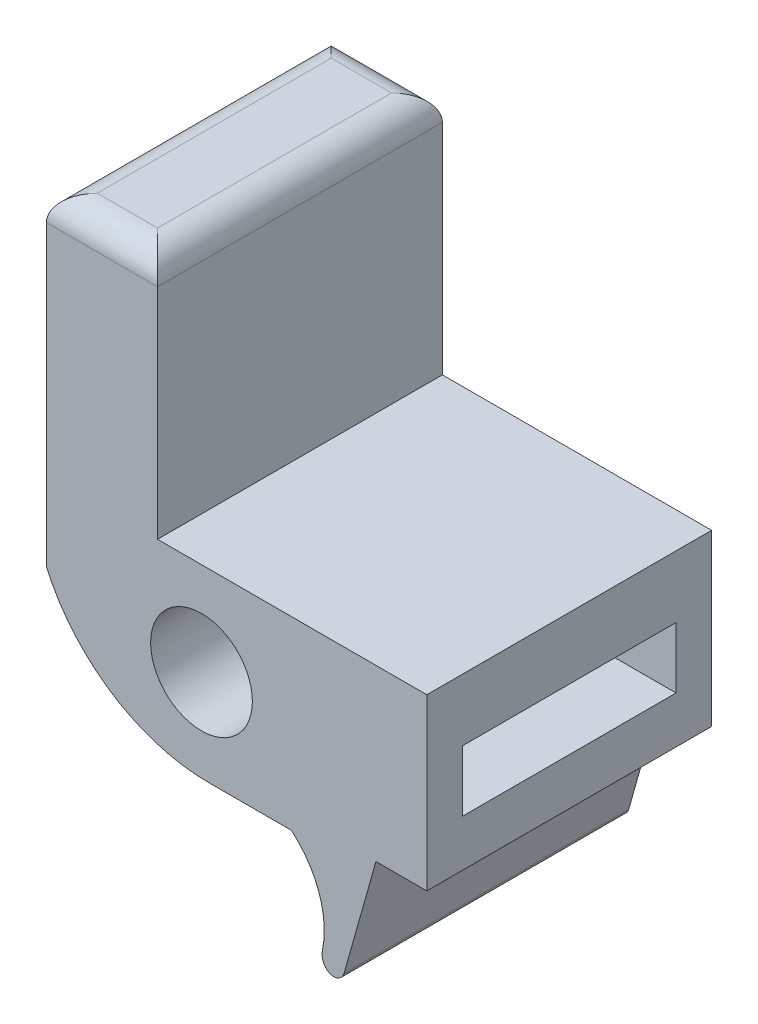
ISO-10303-21;
HEADER;
FILE_DESCRIPTION(('STEP AP214'),'2;1');
FILE_NAME('part.step','',(''),(''),'','','');
FILE_SCHEMA(('AUTOMOTIVE_DESIGN { 1 0 10303 214 1 1 1 1 }'));
ENDSEC;
DATA;
#1=APPLICATION_CONTEXT('core data for automotive mechanical design processes');
#2=APPLICATION_PROTOCOL_DEFINITION('international standard','automotive_design',2000,#1);
#3=PRODUCT_CONTEXT('',#1,'mechanical');
#4=PRODUCT('Part','Part','',(#3));
#5=PRODUCT_RELATED_PRODUCT_CATEGORY('part','',(#4));
#6=PRODUCT_DEFINITION_FORMATION('','',#4);
#7=PRODUCT_DEFINITION_CONTEXT('part definition',#1,'design');
#8=PRODUCT_DEFINITION('design','',#6,#7);
#9=PRODUCT_DEFINITION_SHAPE('','',#8);
#10=(LENGTH_UNIT() NAMED_UNIT(*) SI_UNIT(.MILLI.,.METRE.));
#11=(NAMED_UNIT(*) PLANE_ANGLE_UNIT() SI_UNIT($,.RADIAN.));
#12=(NAMED_UNIT(*) SI_UNIT($,.STERADIAN.) SOLID_ANGLE_UNIT());
#13=UNCERTAINTY_MEASURE_WITH_UNIT(LENGTH_MEASURE(1.E-05),#10,'distance_accuracy_value','');
#14=(GEOMETRIC_REPRESENTATION_CONTEXT(3) GLOBAL_UNCERTAINTY_ASSIGNED_CONTEXT((#13)) GLOBAL_UNIT_ASSIGNED_CONTEXT((#10,
#11,#12)) REPRESENTATION_CONTEXT('',''));
#15=CARTESIAN_POINT('',(0.,0.,0.));
#16=DIRECTION('',(0.,0.,1.));
#17=DIRECTION('',(1.,0.,0.));
#18=AXIS2_PLACEMENT_3D('',#15,#16,#17);
#19=CARTESIAN_POINT('',(-1.30401194965657,6.63,3.2));
#20=DIRECTION('',(-1.,0.,0.));
#21=DIRECTION('',(0.,0.,1.));
#22=AXIS2_PLACEMENT_3D('',#19,#20,#21);
#23=PLANE('',#22);
#24=DIRECTION('',(0.,-1.,0.));
#25=VECTOR('',#24,1.);
#26=CARTESIAN_POINT('',(-1.30401194965657,6.63,3.2));
#27=LINE('',#26,#25);
#28=CARTESIAN_POINT('',(-1.30401194965657,6.13,3.2));
#29=VERTEX_POINT('',#28);
#30=CARTESIAN_POINT('',(-1.30401194965657,1.83,3.2));
#31=VERTEX_POINT('',#30);
#32=EDGE_CURVE('E273',#29,#31,#27,.T.);
#33=ORIENTED_EDGE('',*,*,#32,.T.);
#34=DIRECTION('',(0.,0.,1.));
#35=VECTOR('',#34,1.);
#36=CARTESIAN_POINT('',(-1.30401194965657,1.83,-8.35225188642688));
#37=LINE('',#36,#35);
#38=CARTESIAN_POINT('',(-1.30401194965657,1.83,-2.4));
#39=VERTEX_POINT('',#38);
#40=EDGE_CURVE('E201',#39,#31,#37,.T.);
#41=ORIENTED_EDGE('',*,*,#40,.F.);
#42=DIRECTION('',(0.,-1.,0.));
#43=VECTOR('',#42,1.);
#44=CARTESIAN_POINT('',(-1.30401194965657,6.63,-2.4));
#45=LINE('',#44,#43);
#46=CARTESIAN_POINT('',(-1.30401194965657,6.13,-2.4));
#47=VERTEX_POINT('',#46);
#48=EDGE_CURVE('E172',#47,#39,#45,.T.);
#49=ORIENTED_EDGE('',*,*,#48,.F.);
#50=DIRECTION('',(0.,0.,-1.));
#51=VECTOR('',#50,1.);
#52=CARTESIAN_POINT('',(-1.30401194965657,6.13,3.2));
#53=LINE('',#52,#51);
#54=EDGE_CURVE('E11',#47,#29,#53,.F.);
#55=ORIENTED_EDGE('',*,*,#54,.T.);
#56=EDGE_LOOP('',(#33,#41,#49,#55));
#57=FACE_BOUND('',#56,.T.);
#58=ADVANCED_FACE('F39',(#57),#23,.F.);
#59=CARTESIAN_POINT('',(0.,0.,3.2));
#60=DIRECTION('',(0.,0.,-1.));
#61=DIRECTION('',(-1.,0.,0.));
#62=AXIS2_PLACEMENT_3D('',#59,#60,#61);
#63=PLANE('',#62);
#64=ORIENTED_EDGE('',*,*,#32,.F.);
#65=DIRECTION('',(1.,0.,0.));
#66=VECTOR('',#65,1.);
#67=CARTESIAN_POINT('',(0.,6.13,3.2));
#68=LINE('',#67,#66);
#69=CARTESIAN_POINT('',(-3.49,6.13,3.2));
#70=VERTEX_POINT('',#69);
#71=EDGE_CURVE('E303',#29,#70,#68,.F.);
#72=ORIENTED_EDGE('',*,*,#71,.T.);
#73=DIRECTION('',(0.,1.,0.));
#74=VECTOR('',#73,1.);
#75=CARTESIAN_POINT('',(-3.49,-1.13,3.2));
#76=LINE('',#75,#74);
#77=CARTESIAN_POINT('',(-3.49,0.272255312124217,3.2));
#78=VERTEX_POINT('',#77);
#79=EDGE_CURVE('E270',#78,#70,#76,.T.);
#80=ORIENTED_EDGE('',*,*,#79,.F.);
#81=CARTESIAN_POINT('',(-0.289999999999999,1.69,3.2));
#82=DIRECTION('',(0.,0.,1.));
#83=DIRECTION('',(1.,0.,0.));
#84=AXIS2_PLACEMENT_3D('',#81,#82,#83);
#85=CIRCLE('',#84,3.5);
#86=CARTESIAN_POINT('',(-0.29,-1.81,3.2));
#87=VERTEX_POINT('',#86);
#88=EDGE_CURVE('E188',#78,#87,#85,.T.);
#89=ORIENTED_EDGE('',*,*,#88,.T.);
#90=DIRECTION('',(1.,0.,0.));
#91=VECTOR('',#90,1.);
#92=CARTESIAN_POINT('',(1.32448881185452,-1.81,3.2));
#93=LINE('',#92,#91);
#94=CARTESIAN_POINT('',(1.32448881185452,-1.81,3.2));
#95=VERTEX_POINT('',#94);
#96=EDGE_CURVE('E192',#87,#95,#93,.T.);
#97=ORIENTED_EDGE('',*,*,#96,.T.);
#98=CARTESIAN_POINT('',(0.173037432180999,-3.19353161158246,3.2));
#99=DIRECTION('',(0.,0.,1.));
#100=DIRECTION('',(-1.,0.,0.));
#101=AXIS2_PLACEMENT_3D('',#98,#99,#100);
#102=CIRCLE('',#101,1.8);
#103=CARTESIAN_POINT('',(1.93598887770133,-3.55685268272722,3.2));
#104=VERTEX_POINT('',#103);
#105=EDGE_CURVE('E269',#104,#95,#102,.T.);
#106=ORIENTED_EDGE('',*,*,#105,.F.);
#107=CARTESIAN_POINT('',(2.22981411862138,-3.61740619458468,3.2));
#108=DIRECTION('',(0.,0.,-1.));
#109=DIRECTION('',(-1.,0.,0.));
#110=AXIS2_PLACEMENT_3D('',#107,#108,#109);
#111=CIRCLE('',#110,0.3);
#112=CARTESIAN_POINT('',(1.9954872154378,-3.80473185338345,3.2));
#113=VERTEX_POINT('',#112);
#114=EDGE_CURVE('E281',#104,#113,#111,.F.);
#115=ORIENTED_EDGE('',*,*,#114,.T.);
#116=CARTESIAN_POINT('',(2.15951604766631,-3.67360389222431,3.2));
#117=DIRECTION('',(0.,0.,-1.));
#118=DIRECTION('',(-1.,0.,0.));
#119=AXIS2_PLACEMENT_3D('',#116,#117,#118);
#120=CIRCLE('',#119,0.21);
#121=CARTESIAN_POINT('',(2.36158182630746,-3.73078274410284,3.2));
#122=VERTEX_POINT('',#121);
#123=EDGE_CURVE('E292',#113,#122,#120,.F.);
#124=ORIENTED_EDGE('',*,*,#123,.T.);
#125=DIRECTION('',(-0.272280247040579,-0.962217993529284,0.));
#126=VECTOR('',#125,1.);
#127=CARTESIAN_POINT('',(2.99,-1.51,3.2));
#128=LINE('',#127,#126);
#129=CARTESIAN_POINT('',(2.99,-1.51,3.2));
#130=VERTEX_POINT('',#129);
#131=EDGE_CURVE('E275',#130,#122,#128,.T.);
#132=ORIENTED_EDGE('',*,*,#131,.F.);
#133=DIRECTION('',(-1.,0.,0.));
#134=VECTOR('',#133,1.);
#135=CARTESIAN_POINT('',(3.99,-1.51,3.2));
#136=LINE('',#135,#134);
#137=CARTESIAN_POINT('',(3.99,-1.51,3.2));
#138=VERTEX_POINT('',#137);
#139=EDGE_CURVE('E261',#138,#130,#136,.T.);
#140=ORIENTED_EDGE('',*,*,#139,.F.);
#141=DIRECTION('',(0.,-1.,0.));
#142=VECTOR('',#141,1.);
#143=CARTESIAN_POINT('',(3.99,1.13,3.2));
#144=LINE('',#143,#142);
#145=CARTESIAN_POINT('',(3.99,1.83,3.2));
#146=VERTEX_POINT('',#145);
#147=EDGE_CURVE('E256',#146,#138,#144,.T.);
#148=ORIENTED_EDGE('',*,*,#147,.F.);
#149=DIRECTION('',(-1.,0.,0.));
#150=VECTOR('',#149,1.);
#151=CARTESIAN_POINT('',(-1.30401194965657,1.83,3.2));
#152=LINE('',#151,#150);
#153=EDGE_CURVE('E197',#146,#31,#152,.T.);
#154=ORIENTED_EDGE('',*,*,#153,.T.);
#155=EDGE_LOOP('',(#64,#72,#80,#89,#97,#106,#115,#124,#132,#140,#148,#154));
#156=FACE_BOUND('',#155,.T.);
#157=CARTESIAN_POINT('',(-0.44,0.,3.2));
#158=DIRECTION('',(0.,0.,1.));
#159=DIRECTION('',(1.,0.,0.));
#160=AXIS2_PLACEMENT_3D('',#157,#158,#159);
#161=CIRCLE('',#160,1.);
#162=CARTESIAN_POINT('',(0.56,0.,3.2));
#163=VERTEX_POINT('',#162);
#164=EDGE_CURVE('E276',#163,#163,#161,.T.);
#165=ORIENTED_EDGE('',*,*,#164,.F.);
#166=EDGE_LOOP('',(#165));
#167=FACE_BOUND('',#166,.T.);
#168=ADVANCED_FACE('F332',(#156,#167),#63,.F.);
#169=CARTESIAN_POINT('',(-0.44,0.,3.2));
#170=DIRECTION('',(0.,0.,-1.));
#171=DIRECTION('',(-1.,0.,0.));
#172=AXIS2_PLACEMENT_3D('',#169,#170,#171);
#173=CYLINDRICAL_SURFACE('',#172,1.);
#174=ORIENTED_EDGE('',*,*,#164,.T.);
#175=EDGE_LOOP('',(#174));
#176=FACE_BOUND('',#175,.T.);
#177=CARTESIAN_POINT('',(-0.44,0.,-2.4));
#178=DIRECTION('',(0.,0.,-1.));
#179=DIRECTION('',(-1.,0.,0.));
#180=AXIS2_PLACEMENT_3D('',#177,#178,#179);
#181=CIRCLE('',#180,1.);
#182=CARTESIAN_POINT('',(-1.44,0.,-2.4));
#183=VERTEX_POINT('',#182);
#184=EDGE_CURVE('E239',#183,#183,#181,.T.);
#185=ORIENTED_EDGE('',*,*,#184,.T.);
#186=EDGE_LOOP('',(#185));
#187=FACE_BOUND('',#186,.T.);
#188=ADVANCED_FACE('F342',(#176,#187),#173,.F.);
#189=CARTESIAN_POINT('',(0.,6.63,0.));
#190=DIRECTION('',(0.,-1.,0.));
#191=DIRECTION('',(0.,0.,-1.));
#192=AXIS2_PLACEMENT_3D('',#189,#190,#191);
#193=PLANE('',#192);
#194=DIRECTION('',(0.,0.,-1.));
#195=VECTOR('',#194,1.);
#196=CARTESIAN_POINT('',(-2.99,6.63,3.2));
#197=LINE('',#196,#195);
#198=CARTESIAN_POINT('',(-2.99,6.63,-1.9));
#199=VERTEX_POINT('',#198);
#200=CARTESIAN_POINT('',(-2.99,6.63,2.7));
#201=VERTEX_POINT('',#200);
#202=EDGE_CURVE('E296',#199,#201,#197,.F.);
#203=ORIENTED_EDGE('',*,*,#202,.T.);
#204=DIRECTION('',(1.,0.,0.));
#205=VECTOR('',#204,1.);
#206=CARTESIAN_POINT('',(0.,6.63,2.7));
#207=LINE('',#206,#205);
#208=CARTESIAN_POINT('',(-1.80401194965657,6.63,2.7));
#209=VERTEX_POINT('',#208);
#210=EDGE_CURVE('E297',#201,#209,#207,.T.);
#211=ORIENTED_EDGE('',*,*,#210,.T.);
#212=DIRECTION('',(0.,0.,-1.));
#213=VECTOR('',#212,1.);
#214=CARTESIAN_POINT('',(-1.80401194965657,6.63,0.));
#215=LINE('',#214,#213);
#216=CARTESIAN_POINT('',(-1.80401194965657,6.63,-1.9));
#217=VERTEX_POINT('',#216);
#218=EDGE_CURVE('E295',#209,#217,#215,.T.);
#219=ORIENTED_EDGE('',*,*,#218,.T.);
#220=DIRECTION('',(1.,0.,0.));
#221=VECTOR('',#220,1.);
#222=CARTESIAN_POINT('',(-3.49,6.63,-1.9));
#223=LINE('',#222,#221);
#224=EDGE_CURVE('E298',#217,#199,#223,.F.);
#225=ORIENTED_EDGE('',*,*,#224,.T.);
#226=EDGE_LOOP('',(#203,#211,#219,#225));
#227=FACE_BOUND('',#226,.T.);
#228=ADVANCED_FACE('F336',(#227),#193,.F.);
#229=CARTESIAN_POINT('',(0.173037432180999,-3.19353161158246,3.2));
#230=DIRECTION('',(0.,0.,-1.));
#231=DIRECTION('',(-1.,0.,0.));
#232=AXIS2_PLACEMENT_3D('',#229,#230,#231);
#233=CYLINDRICAL_SURFACE('',#232,1.8);
#234=DIRECTION('',(0.,0.,1.));
#235=VECTOR('',#234,1.);
#236=CARTESIAN_POINT('',(1.32448881185452,-1.81,-8.35225188642688));
#237=LINE('',#236,#235);
#238=CARTESIAN_POINT('',(1.32448881185452,-1.81,-2.4));
#239=VERTEX_POINT('',#238);
#240=EDGE_CURVE('E205',#239,#95,#237,.T.);
#241=ORIENTED_EDGE('',*,*,#240,.F.);
#242=CARTESIAN_POINT('',(0.173037432180999,-3.19353161158246,-2.4));
#243=DIRECTION('',(0.,0.,1.));
#244=DIRECTION('',(-1.,0.,0.));
#245=AXIS2_PLACEMENT_3D('',#242,#243,#244);
#246=CIRCLE('',#245,1.8);
#247=CARTESIAN_POINT('',(1.93598887770133,-3.55685268272722,-2.4));
#248=VERTEX_POINT('',#247);
#249=EDGE_CURVE('E174',#248,#239,#246,.T.);
#250=ORIENTED_EDGE('',*,*,#249,.F.);
#251=DIRECTION('',(0.,0.,-1.));
#252=VECTOR('',#251,1.);
#253=CARTESIAN_POINT('',(1.93598887770133,-3.55685268272722,3.2));
#254=LINE('',#253,#252);
#255=EDGE_CURVE('E282',#248,#104,#254,.F.);
#256=ORIENTED_EDGE('',*,*,#255,.T.);
#257=ORIENTED_EDGE('',*,*,#105,.T.);
#258=EDGE_LOOP('',(#241,#250,#256,#257));
#259=FACE_BOUND('',#258,.T.);
#260=ADVANCED_FACE('F338',(#259),#233,.F.);
#261=CARTESIAN_POINT('',(2.99,-1.51,3.2));
#262=DIRECTION('',(0.962217993529284,-0.272280247040579,0.));
#263=DIRECTION('',(0.272280247040579,0.962217993529284,0.));
#264=AXIS2_PLACEMENT_3D('',#261,#262,#263);
#265=PLANE('',#264);
#266=ORIENTED_EDGE('',*,*,#131,.T.);
#267=DIRECTION('',(0.,0.,-1.));
#268=VECTOR('',#267,1.);
#269=CARTESIAN_POINT('',(2.36158182630746,-3.73078274410284,3.2));
#270=LINE('',#269,#268);
#271=CARTESIAN_POINT('',(2.36158182630746,-3.73078274410284,-2.4));
#272=VERTEX_POINT('',#271);
#273=EDGE_CURVE('E288',#122,#272,#270,.T.);
#274=ORIENTED_EDGE('',*,*,#273,.T.);
#275=DIRECTION('',(-0.272280247040579,-0.962217993529284,0.));
#276=VECTOR('',#275,1.);
#277=CARTESIAN_POINT('',(2.99,-1.51,-2.4));
#278=LINE('',#277,#276);
#279=CARTESIAN_POINT('',(2.99,-1.51,-2.4));
#280=VERTEX_POINT('',#279);
#281=EDGE_CURVE('E252',#280,#272,#278,.T.);
#282=ORIENTED_EDGE('',*,*,#281,.F.);
#283=DIRECTION('',(0.,0.,-1.));
#284=VECTOR('',#283,1.);
#285=CARTESIAN_POINT('',(2.99,-1.51,3.2));
#286=LINE('',#285,#284);
#287=EDGE_CURVE('E278',#130,#280,#286,.T.);
#288=ORIENTED_EDGE('',*,*,#287,.F.);
#289=EDGE_LOOP('',(#266,#274,#282,#288));
#290=FACE_BOUND('',#289,.T.);
#291=ADVANCED_FACE('F347',(#290),#265,.T.);
#292=CARTESIAN_POINT('',(2.22981411862138,-3.61740619458468,3.2));
#293=DIRECTION('',(0.,0.,-1.));
#294=DIRECTION('',(-1.,0.,0.));
#295=AXIS2_PLACEMENT_3D('',#292,#293,#294);
#296=CYLINDRICAL_SURFACE('',#295,0.3);
#297=ORIENTED_EDGE('',*,*,#255,.F.);
#298=CARTESIAN_POINT('',(2.22981411862138,-3.61740619458468,-2.4));
#299=DIRECTION('',(0.,0.,-1.));
#300=DIRECTION('',(-1.,0.,0.));
#301=AXIS2_PLACEMENT_3D('',#298,#299,#300);
#302=CIRCLE('',#301,0.3);
#303=CARTESIAN_POINT('',(1.9954872154378,-3.80473185338345,-2.4));
#304=VERTEX_POINT('',#303);
#305=EDGE_CURVE('E260',#304,#248,#302,.T.);
#306=ORIENTED_EDGE('',*,*,#305,.F.);
#307=DIRECTION('',(0.,0.,-1.));
#308=VECTOR('',#307,1.);
#309=CARTESIAN_POINT('',(1.9954872154378,-3.80473185338345,3.2));
#310=LINE('',#309,#308);
#311=EDGE_CURVE('E286',#304,#113,#310,.F.);
#312=ORIENTED_EDGE('',*,*,#311,.T.);
#313=ORIENTED_EDGE('',*,*,#114,.F.);
#314=EDGE_LOOP('',(#297,#306,#312,#313));
#315=FACE_BOUND('',#314,.T.);
#316=ADVANCED_FACE('F365',(#315),#296,.T.);
#317=CARTESIAN_POINT('',(2.15951604766631,-3.67360389222431,3.2));
#318=DIRECTION('',(0.,0.,-1.));
#319=DIRECTION('',(-1.,0.,0.));
#320=AXIS2_PLACEMENT_3D('',#317,#318,#319);
#321=CYLINDRICAL_SURFACE('',#320,0.21);
#322=ORIENTED_EDGE('',*,*,#123,.F.);
#323=ORIENTED_EDGE('',*,*,#311,.F.);
#324=CARTESIAN_POINT('',(2.15951604766631,-3.67360389222431,-2.4));
#325=DIRECTION('',(0.,0.,-1.));
#326=DIRECTION('',(-1.,0.,0.));
#327=AXIS2_PLACEMENT_3D('',#324,#325,#326);
#328=CIRCLE('',#327,0.21);
#329=EDGE_CURVE('E251',#272,#304,#328,.T.);
#330=ORIENTED_EDGE('',*,*,#329,.F.);
#331=ORIENTED_EDGE('',*,*,#273,.F.);
#332=EDGE_LOOP('',(#322,#323,#330,#331));
#333=FACE_BOUND('',#332,.T.);
#334=ADVANCED_FACE('F362',(#333),#321,.T.);
#335=CARTESIAN_POINT('',(-3.49,0.,0.));
#336=DIRECTION('',(-1.,0.,0.));
#337=DIRECTION('',(0.,0.,1.));
#338=AXIS2_PLACEMENT_3D('',#335,#336,#337);
#339=PLANE('',#338);
#340=ORIENTED_EDGE('',*,*,#79,.T.);
#341=DIRECTION('',(0.,0.,-1.));
#342=VECTOR('',#341,1.);
#343=CARTESIAN_POINT('',(-3.49,6.13,-2.4));
#344=LINE('',#343,#342);
#345=CARTESIAN_POINT('',(-3.49,6.13,-2.4));
#346=VERTEX_POINT('',#345);
#347=EDGE_CURVE('E173',#70,#346,#344,.T.);
#348=ORIENTED_EDGE('',*,*,#347,.T.);
#349=DIRECTION('',(0.,1.,0.));
#350=VECTOR('',#349,1.);
#351=CARTESIAN_POINT('',(-3.49,1.69,-2.4));
#352=LINE('',#351,#350);
#353=CARTESIAN_POINT('',(-3.49,0.272255312124217,-2.4));
#354=VERTEX_POINT('',#353);
#355=EDGE_CURVE('E164',#354,#346,#352,.T.);
#356=ORIENTED_EDGE('',*,*,#355,.F.);
#357=DIRECTION('',(0.,0.,1.));
#358=VECTOR('',#357,1.);
#359=CARTESIAN_POINT('',(-3.49,0.272255312124217,-8.35225188642688));
#360=LINE('',#359,#358);
#361=EDGE_CURVE('E167',#354,#78,#360,.T.);
#362=ORIENTED_EDGE('',*,*,#361,.T.);
#363=EDGE_LOOP('',(#340,#348,#356,#362));
#364=FACE_BOUND('',#363,.T.);
#365=ADVANCED_FACE('F166',(#364),#339,.T.);
#366=CARTESIAN_POINT('',(3.99,-1.51,3.2));
#367=DIRECTION('',(0.,1.,0.));
#368=DIRECTION('',(0.,0.,1.));
#369=AXIS2_PLACEMENT_3D('',#366,#367,#368);
#370=PLANE('',#369);
#371=ORIENTED_EDGE('',*,*,#287,.T.);
#372=DIRECTION('',(-1.,0.,0.));
#373=VECTOR('',#372,1.);
#374=CARTESIAN_POINT('',(3.99,-1.51,-2.4));
#375=LINE('',#374,#373);
#376=CARTESIAN_POINT('',(3.99,-1.51,-2.4));
#377=VERTEX_POINT('',#376);
#378=EDGE_CURVE('E247',#377,#280,#375,.T.);
#379=ORIENTED_EDGE('',*,*,#378,.F.);
#380=DIRECTION('',(0.,0.,-1.));
#381=VECTOR('',#380,1.);
#382=CARTESIAN_POINT('',(3.99,-1.51,3.2));
#383=LINE('',#382,#381);
#384=EDGE_CURVE('E262',#138,#377,#383,.T.);
#385=ORIENTED_EDGE('',*,*,#384,.F.);
#386=ORIENTED_EDGE('',*,*,#139,.T.);
#387=EDGE_LOOP('',(#371,#379,#385,#386));
#388=FACE_BOUND('',#387,.T.);
#389=ADVANCED_FACE('F387',(#388),#370,.F.);
#390=CARTESIAN_POINT('',(3.99,0.,0.));
#391=DIRECTION('',(1.,0.,0.));
#392=DIRECTION('',(0.,0.,-1.));
#393=AXIS2_PLACEMENT_3D('',#390,#391,#392);
#394=PLANE('',#393);
#395=DIRECTION('',(0.,-1.,0.));
#396=VECTOR('',#395,1.);
#397=CARTESIAN_POINT('',(3.99,0.609999999999998,2.5));
#398=LINE('',#397,#396);
#399=CARTESIAN_POINT('',(3.99,0.609999999999998,2.5));
#400=VERTEX_POINT('',#399);
#401=CARTESIAN_POINT('',(3.99,-0.590000000000002,2.5));
#402=VERTEX_POINT('',#401);
#403=EDGE_CURVE('E57',#400,#402,#398,.T.);
#404=ORIENTED_EDGE('',*,*,#403,.F.);
#405=DIRECTION('',(0.,0.,1.));
#406=VECTOR('',#405,1.);
#407=CARTESIAN_POINT('',(3.99,0.609999999999998,2.5));
#408=LINE('',#407,#406);
#409=CARTESIAN_POINT('',(3.99,0.61,-1.7));
#410=VERTEX_POINT('',#409);
#411=EDGE_CURVE('E213',#410,#400,#408,.T.);
#412=ORIENTED_EDGE('',*,*,#411,.F.);
#413=DIRECTION('',(0.,1.,0.));
#414=VECTOR('',#413,1.);
#415=CARTESIAN_POINT('',(3.99,0.61,-1.7));
#416=LINE('',#415,#414);
#417=CARTESIAN_POINT('',(3.99,-0.59,-1.7));
#418=VERTEX_POINT('',#417);
#419=EDGE_CURVE('E227',#418,#410,#416,.T.);
#420=ORIENTED_EDGE('',*,*,#419,.F.);
#421=DIRECTION('',(0.,0.,-1.));
#422=VECTOR('',#421,1.);
#423=CARTESIAN_POINT('',(3.99,-0.590000000000002,2.5));
#424=LINE('',#423,#422);
#425=EDGE_CURVE('E224',#402,#418,#424,.T.);
#426=ORIENTED_EDGE('',*,*,#425,.F.);
#427=EDGE_LOOP('',(#404,#412,#420,#426));
#428=FACE_BOUND('',#427,.T.);
#429=ORIENTED_EDGE('',*,*,#147,.T.);
#430=ORIENTED_EDGE('',*,*,#384,.T.);
#431=DIRECTION('',(0.,-1.,0.));
#432=VECTOR('',#431,1.);
#433=CARTESIAN_POINT('',(3.99,1.53,-2.4));
#434=LINE('',#433,#432);
#435=CARTESIAN_POINT('',(3.99,1.83,-2.4));
#436=VERTEX_POINT('',#435);
#437=EDGE_CURVE('E244',#436,#377,#434,.T.);
#438=ORIENTED_EDGE('',*,*,#437,.F.);
#439=DIRECTION('',(0.,0.,1.));
#440=VECTOR('',#439,1.);
#441=CARTESIAN_POINT('',(3.99,1.83,-8.35225188642688));
#442=LINE('',#441,#440);
#443=EDGE_CURVE('E202',#436,#146,#442,.T.);
#444=ORIENTED_EDGE('',*,*,#443,.T.);
#445=EDGE_LOOP('',(#429,#430,#438,#444));
#446=FACE_BOUND('',#445,.T.);
#447=ADVANCED_FACE('F379',(#428,#446),#394,.T.);
#448=CARTESIAN_POINT('',(0.173037432180999,-3.19353161158246,-2.4));
#449=DIRECTION('',(0.,0.,-1.));
#450=DIRECTION('',(-1.,0.,0.));
#451=AXIS2_PLACEMENT_3D('',#448,#449,#450);
#452=PLANE('',#451);
#453=DIRECTION('',(-1.,0.,0.));
#454=VECTOR('',#453,1.);
#455=CARTESIAN_POINT('',(-1.30401194965657,1.83,-2.4));
#456=LINE('',#455,#454);
#457=EDGE_CURVE('E203',#436,#39,#456,.T.);
#458=ORIENTED_EDGE('',*,*,#457,.F.);
#459=ORIENTED_EDGE('',*,*,#437,.T.);
#460=ORIENTED_EDGE('',*,*,#378,.T.);
#461=ORIENTED_EDGE('',*,*,#281,.T.);
#462=ORIENTED_EDGE('',*,*,#329,.T.);
#463=ORIENTED_EDGE('',*,*,#305,.T.);
#464=ORIENTED_EDGE('',*,*,#249,.T.);
#465=DIRECTION('',(1.,0.,0.));
#466=VECTOR('',#465,1.);
#467=CARTESIAN_POINT('',(1.32448881185452,-1.81,-2.4));
#468=LINE('',#467,#466);
#469=CARTESIAN_POINT('',(-0.29,-1.81,-2.4));
#470=VERTEX_POINT('',#469);
#471=EDGE_CURVE('E182',#470,#239,#468,.T.);
#472=ORIENTED_EDGE('',*,*,#471,.F.);
#473=CARTESIAN_POINT('',(-0.289999999999999,1.69,-2.4));
#474=DIRECTION('',(0.,0.,-1.));
#475=DIRECTION('',(-1.,0.,0.));
#476=AXIS2_PLACEMENT_3D('',#473,#474,#475);
#477=CIRCLE('',#476,3.5);
#478=EDGE_CURVE('E178',#354,#470,#477,.F.);
#479=ORIENTED_EDGE('',*,*,#478,.F.);
#480=ORIENTED_EDGE('',*,*,#355,.T.);
#481=DIRECTION('',(1.,0.,0.));
#482=VECTOR('',#481,1.);
#483=CARTESIAN_POINT('',(-1.30401194965657,6.13,-2.4));
#484=LINE('',#483,#482);
#485=EDGE_CURVE('E48',#346,#47,#484,.T.);
#486=ORIENTED_EDGE('',*,*,#485,.T.);
#487=ORIENTED_EDGE('',*,*,#48,.T.);
#488=EDGE_LOOP('',(#458,#459,#460,#461,#462,#463,#464,#472,#479,#480,#486,#487));
#489=FACE_BOUND('',#488,.T.);
#490=ORIENTED_EDGE('',*,*,#184,.F.);
#491=EDGE_LOOP('',(#490));
#492=FACE_BOUND('',#491,.T.);
#493=ADVANCED_FACE('F179',(#489,#492),#452,.T.);
#494=CARTESIAN_POINT('',(0.173037432180999,6.13,-1.9));
#495=DIRECTION('',(-1.,0.,0.));
#496=DIRECTION('',(0.,0.,1.));
#497=AXIS2_PLACEMENT_3D('',#494,#495,#496);
#498=CYLINDRICAL_SURFACE('',#497,0.5);
#499=CARTESIAN_POINT('',(-1.80401194965657,6.13,-1.9));
#500=DIRECTION('',(-0.707106781186547,0.,-0.707106781186547));
#501=DIRECTION('',(0.707106781186547,0.,-0.707106781186547));
#502=AXIS2_PLACEMENT_3D('',#499,#500,#501);
#503=ELLIPSE('',#502,0.707106781186547,0.5);
#504=EDGE_CURVE('E309',#47,#217,#503,.F.);
#505=ORIENTED_EDGE('',*,*,#504,.F.);
#506=ORIENTED_EDGE('',*,*,#485,.F.);
#507=CARTESIAN_POINT('',(-2.99,6.13,-1.9));
#508=DIRECTION('',(-0.707106781186547,0.,0.707106781186547));
#509=DIRECTION('',(-0.707106781186547,0.,-0.707106781186547));
#510=AXIS2_PLACEMENT_3D('',#507,#508,#509);
#511=ELLIPSE('',#510,0.707106781186547,0.5);
#512=EDGE_CURVE('E43',#199,#346,#511,.T.);
#513=ORIENTED_EDGE('',*,*,#512,.F.);
#514=ORIENTED_EDGE('',*,*,#224,.F.);
#515=EDGE_LOOP('',(#505,#506,#513,#514));
#516=FACE_BOUND('',#515,.T.);
#517=ADVANCED_FACE('F41',(#516),#498,.T.);
#518=CARTESIAN_POINT('',(-2.99,6.13,0.));
#519=DIRECTION('',(0.,0.,1.));
#520=DIRECTION('',(1.,0.,0.));
#521=AXIS2_PLACEMENT_3D('',#518,#519,#520);
#522=CYLINDRICAL_SURFACE('',#521,0.5);
#523=ORIENTED_EDGE('',*,*,#512,.T.);
#524=ORIENTED_EDGE('',*,*,#347,.F.);
#525=CARTESIAN_POINT('',(-2.99,6.13,2.7));
#526=DIRECTION('',(0.707106781186547,0.,0.707106781186547));
#527=DIRECTION('',(-0.707106781186547,0.,0.707106781186547));
#528=AXIS2_PLACEMENT_3D('',#525,#526,#527);
#529=ELLIPSE('',#528,0.707106781186547,0.5);
#530=EDGE_CURVE('E307',#201,#70,#529,.T.);
#531=ORIENTED_EDGE('',*,*,#530,.F.);
#532=ORIENTED_EDGE('',*,*,#202,.F.);
#533=EDGE_LOOP('',(#523,#524,#531,#532));
#534=FACE_BOUND('',#533,.T.);
#535=ADVANCED_FACE('F318',(#534),#522,.T.);
#536=CARTESIAN_POINT('',(-1.80401194965657,6.13,0.));
#537=DIRECTION('',(0.,0.,-1.));
#538=DIRECTION('',(-1.,0.,0.));
#539=AXIS2_PLACEMENT_3D('',#536,#537,#538);
#540=CYLINDRICAL_SURFACE('',#539,0.5);
#541=ORIENTED_EDGE('',*,*,#504,.T.);
#542=ORIENTED_EDGE('',*,*,#218,.F.);
#543=CARTESIAN_POINT('',(-1.80401194965657,6.13,2.7));
#544=DIRECTION('',(0.707106781186547,0.,-0.707106781186547));
#545=DIRECTION('',(-0.707106781186547,0.,-0.707106781186547));
#546=AXIS2_PLACEMENT_3D('',#543,#544,#545);
#547=ELLIPSE('',#546,0.707106781186547,0.5);
#548=EDGE_CURVE('E234',#29,#209,#547,.F.);
#549=ORIENTED_EDGE('',*,*,#548,.F.);
#550=ORIENTED_EDGE('',*,*,#54,.F.);
#551=EDGE_LOOP('',(#541,#542,#549,#550));
#552=FACE_BOUND('',#551,.T.);
#553=ADVANCED_FACE('F321',(#552),#540,.T.);
#554=CARTESIAN_POINT('',(0.,6.13,2.7));
#555=DIRECTION('',(1.,0.,0.));
#556=DIRECTION('',(0.,0.,-1.));
#557=AXIS2_PLACEMENT_3D('',#554,#555,#556);
#558=CYLINDRICAL_SURFACE('',#557,0.5);
#559=ORIENTED_EDGE('',*,*,#530,.T.);
#560=ORIENTED_EDGE('',*,*,#71,.F.);
#561=ORIENTED_EDGE('',*,*,#548,.T.);
#562=ORIENTED_EDGE('',*,*,#210,.F.);
#563=EDGE_LOOP('',(#559,#560,#561,#562));
#564=FACE_BOUND('',#563,.T.);
#565=ADVANCED_FACE('F331',(#564),#558,.T.);
#566=CARTESIAN_POINT('',(0.99,0.609999999999998,2.5));
#567=DIRECTION('',(0.,0.,1.));
#568=DIRECTION('',(0.,-1.,0.));
#569=AXIS2_PLACEMENT_3D('',#566,#567,#568);
#570=PLANE('',#569);
#571=ORIENTED_EDGE('',*,*,#403,.T.);
#572=DIRECTION('',(1.,0.,0.));
#573=VECTOR('',#572,1.);
#574=CARTESIAN_POINT('',(0.99,-0.590000000000002,2.5));
#575=LINE('',#574,#573);
#576=CARTESIAN_POINT('',(0.99,-0.590000000000002,2.5));
#577=VERTEX_POINT('',#576);
#578=EDGE_CURVE('E225',#577,#402,#575,.T.);
#579=ORIENTED_EDGE('',*,*,#578,.F.);
#580=DIRECTION('',(0.,-1.,0.));
#581=VECTOR('',#580,1.);
#582=CARTESIAN_POINT('',(0.99,0.609999999999998,2.5));
#583=LINE('',#582,#581);
#584=CARTESIAN_POINT('',(0.99,0.609999999999998,2.5));
#585=VERTEX_POINT('',#584);
#586=EDGE_CURVE('E209',#585,#577,#583,.T.);
#587=ORIENTED_EDGE('',*,*,#586,.F.);
#588=DIRECTION('',(1.,0.,0.));
#589=VECTOR('',#588,1.);
#590=CARTESIAN_POINT('',(0.99,0.609999999999998,2.5));
#591=LINE('',#590,#589);
#592=EDGE_CURVE('E235',#585,#400,#591,.T.);
#593=ORIENTED_EDGE('',*,*,#592,.T.);
#594=EDGE_LOOP('',(#571,#579,#587,#593));
#595=FACE_BOUND('',#594,.T.);
#596=ADVANCED_FACE('F375',(#595),#570,.F.);
#597=CARTESIAN_POINT('',(0.99,0.609999999999998,2.5));
#598=DIRECTION('',(0.,1.,0.));
#599=DIRECTION('',(0.,0.,1.));
#600=AXIS2_PLACEMENT_3D('',#597,#598,#599);
#601=PLANE('',#600);
#602=ORIENTED_EDGE('',*,*,#411,.T.);
#603=ORIENTED_EDGE('',*,*,#592,.F.);
#604=DIRECTION('',(0.,0.,1.));
#605=VECTOR('',#604,1.);
#606=CARTESIAN_POINT('',(0.99,0.609999999999998,2.5));
#607=LINE('',#606,#605);
#608=CARTESIAN_POINT('',(0.99,0.61,-1.7));
#609=VERTEX_POINT('',#608);
#610=EDGE_CURVE('E220',#609,#585,#607,.T.);
#611=ORIENTED_EDGE('',*,*,#610,.F.);
#612=DIRECTION('',(1.,0.,0.));
#613=VECTOR('',#612,1.);
#614=CARTESIAN_POINT('',(0.99,0.61,-1.7));
#615=LINE('',#614,#613);
#616=EDGE_CURVE('E232',#609,#410,#615,.T.);
#617=ORIENTED_EDGE('',*,*,#616,.T.);
#618=EDGE_LOOP('',(#602,#603,#611,#617));
#619=FACE_BOUND('',#618,.T.);
#620=ADVANCED_FACE('F431',(#619),#601,.F.);
#621=CARTESIAN_POINT('',(0.99,0.61,-1.7));
#622=DIRECTION('',(0.,0.,-1.));
#623=DIRECTION('',(0.,1.,0.));
#624=AXIS2_PLACEMENT_3D('',#621,#622,#623);
#625=PLANE('',#624);
#626=ORIENTED_EDGE('',*,*,#419,.T.);
#627=ORIENTED_EDGE('',*,*,#616,.F.);
#628=DIRECTION('',(0.,1.,0.));
#629=VECTOR('',#628,1.);
#630=CARTESIAN_POINT('',(0.99,0.61,-1.7));
#631=LINE('',#630,#629);
#632=CARTESIAN_POINT('',(0.99,-0.59,-1.7));
#633=VERTEX_POINT('',#632);
#634=EDGE_CURVE('E218',#633,#609,#631,.T.);
#635=ORIENTED_EDGE('',*,*,#634,.F.);
#636=DIRECTION('',(1.,0.,0.));
#637=VECTOR('',#636,1.);
#638=CARTESIAN_POINT('',(0.99,-0.59,-1.7));
#639=LINE('',#638,#637);
#640=EDGE_CURVE('E240',#633,#418,#639,.T.);
#641=ORIENTED_EDGE('',*,*,#640,.T.);
#642=EDGE_LOOP('',(#626,#627,#635,#641));
#643=FACE_BOUND('',#642,.T.);
#644=ADVANCED_FACE('F432',(#643),#625,.F.);
#645=CARTESIAN_POINT('',(0.99,-0.590000000000002,2.5));
#646=DIRECTION('',(0.,-1.,0.));
#647=DIRECTION('',(0.,0.,-1.));
#648=AXIS2_PLACEMENT_3D('',#645,#646,#647);
#649=PLANE('',#648);
#650=ORIENTED_EDGE('',*,*,#425,.T.);
#651=ORIENTED_EDGE('',*,*,#640,.F.);
#652=DIRECTION('',(0.,0.,-1.));
#653=VECTOR('',#652,1.);
#654=CARTESIAN_POINT('',(0.99,-0.590000000000002,2.5));
#655=LINE('',#654,#653);
#656=EDGE_CURVE('E215',#577,#633,#655,.T.);
#657=ORIENTED_EDGE('',*,*,#656,.F.);
#658=ORIENTED_EDGE('',*,*,#578,.T.);
#659=EDGE_LOOP('',(#650,#651,#657,#658));
#660=FACE_BOUND('',#659,.T.);
#661=ADVANCED_FACE('F429',(#660),#649,.F.);
#662=CARTESIAN_POINT('',(0.99,0.,0.));
#663=DIRECTION('',(1.,0.,0.));
#664=DIRECTION('',(0.,0.,-1.));
#665=AXIS2_PLACEMENT_3D('',#662,#663,#664);
#666=PLANE('',#665);
#667=ORIENTED_EDGE('',*,*,#586,.T.);
#668=ORIENTED_EDGE('',*,*,#656,.T.);
#669=ORIENTED_EDGE('',*,*,#634,.T.);
#670=ORIENTED_EDGE('',*,*,#610,.T.);
#671=EDGE_LOOP('',(#667,#668,#669,#670));
#672=FACE_BOUND('',#671,.T.);
#673=ADVANCED_FACE('F428',(#672),#666,.T.);
#674=CARTESIAN_POINT('',(-1.30401194965657,1.83,-8.35225188642688));
#675=DIRECTION('',(0.,1.,0.));
#676=DIRECTION('',(0.,0.,1.));
#677=AXIS2_PLACEMENT_3D('',#674,#675,#676);
#678=PLANE('',#677);
#679=ORIENTED_EDGE('',*,*,#443,.F.);
#680=ORIENTED_EDGE('',*,*,#457,.T.);
#681=ORIENTED_EDGE('',*,*,#40,.T.);
#682=ORIENTED_EDGE('',*,*,#153,.F.);
#683=EDGE_LOOP('',(#679,#680,#681,#682));
#684=FACE_BOUND('',#683,.T.);
#685=ADVANCED_FACE('F422',(#684),#678,.T.);
#686=CARTESIAN_POINT('',(-0.289999999999999,1.69,-8.35225188642688));
#687=DIRECTION('',(0.,0.,1.));
#688=DIRECTION('',(1.,0.,0.));
#689=AXIS2_PLACEMENT_3D('',#686,#687,#688);
#690=CYLINDRICAL_SURFACE('',#689,3.5);
#691=ORIENTED_EDGE('',*,*,#361,.F.);
#692=ORIENTED_EDGE('',*,*,#478,.T.);
#693=DIRECTION('',(0.,0.,1.));
#694=VECTOR('',#693,1.);
#695=CARTESIAN_POINT('',(-0.29,-1.81,-8.35225188642688));
#696=LINE('',#695,#694);
#697=EDGE_CURVE('E187',#470,#87,#696,.T.);
#698=ORIENTED_EDGE('',*,*,#697,.T.);
#699=ORIENTED_EDGE('',*,*,#88,.F.);
#700=EDGE_LOOP('',(#691,#692,#698,#699));
#701=FACE_BOUND('',#700,.T.);
#702=ADVANCED_FACE('F189',(#701),#690,.T.);
#703=CARTESIAN_POINT('',(1.32448881185452,-1.81,-8.35225188642688));
#704=DIRECTION('',(0.,-1.,0.));
#705=DIRECTION('',(0.,0.,-1.));
#706=AXIS2_PLACEMENT_3D('',#703,#704,#705);
#707=PLANE('',#706);
#708=ORIENTED_EDGE('',*,*,#697,.F.);
#709=ORIENTED_EDGE('',*,*,#471,.T.);
#710=ORIENTED_EDGE('',*,*,#240,.T.);
#711=ORIENTED_EDGE('',*,*,#96,.F.);
#712=EDGE_LOOP('',(#708,#709,#710,#711));
#713=FACE_BOUND('',#712,.T.);
#714=ADVANCED_FACE('F415',(#713),#707,.T.);
#715=CLOSED_SHELL('',(#58,#168,#188,#228,#260,#291,#316,#334,#365,#389,#447,#493,#517,#535,#553,
#565,#596,#620,#644,#661,#673,#685,#702,#714));
#716=MANIFOLD_SOLID_BREP('B2',#715);
#717=ADVANCED_BREP_SHAPE_REPRESENTATION('',(#18,#716),#14);
#718=SHAPE_DEFINITION_REPRESENTATION(#9,#717);
ENDSEC;
END-ISO-10303-21;
